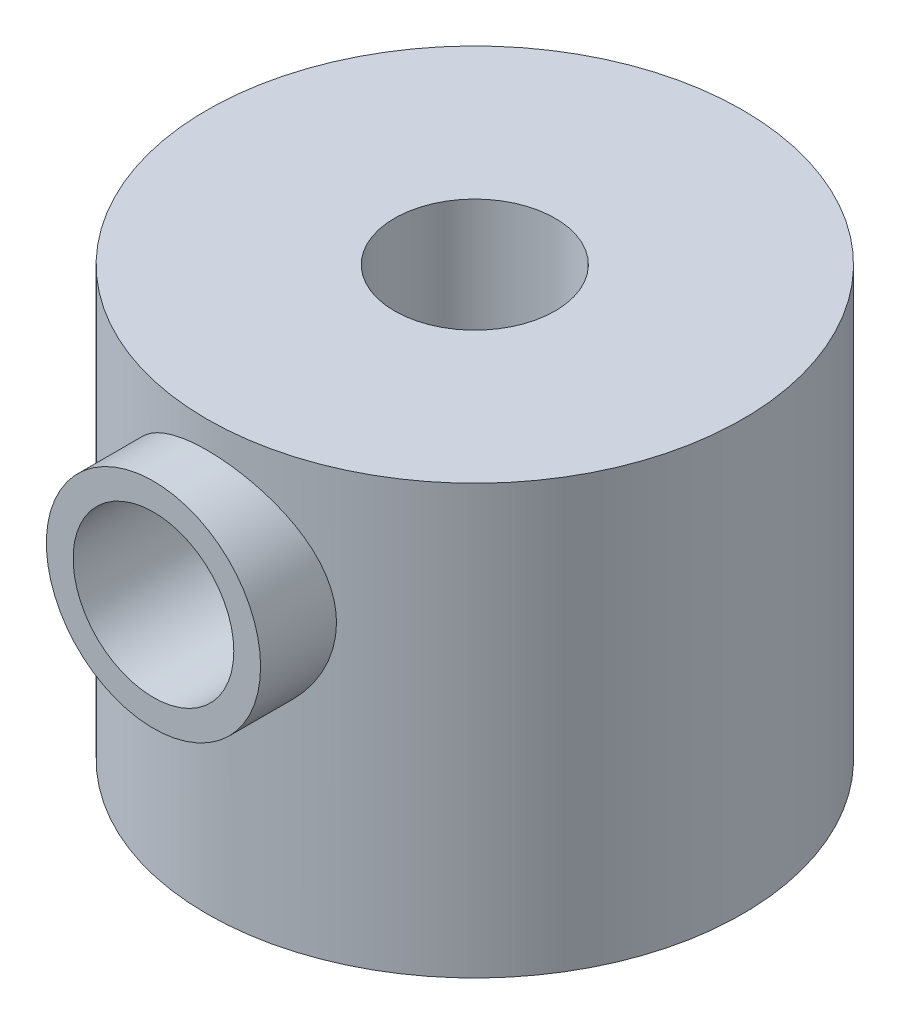
ISO-10303-21;
HEADER;
FILE_DESCRIPTION(('STEP AP214'),'2;1');
FILE_NAME('part.step','',(''),(''),'','','');
FILE_SCHEMA(('AUTOMOTIVE_DESIGN { 1 0 10303 214 1 1 1 1 }'));
ENDSEC;
DATA;
#1=APPLICATION_CONTEXT('core data for automotive mechanical design processes');
#2=APPLICATION_PROTOCOL_DEFINITION('international standard','automotive_design',2000,#1);
#3=PRODUCT_CONTEXT('',#1,'mechanical');
#4=PRODUCT('Part','Part','',(#3));
#5=PRODUCT_RELATED_PRODUCT_CATEGORY('part','',(#4));
#6=PRODUCT_DEFINITION_FORMATION('','',#4);
#7=PRODUCT_DEFINITION_CONTEXT('part definition',#1,'design');
#8=PRODUCT_DEFINITION('design','',#6,#7);
#9=PRODUCT_DEFINITION_SHAPE('','',#8);
#10=(LENGTH_UNIT() NAMED_UNIT(*) SI_UNIT(.MILLI.,.METRE.));
#11=(NAMED_UNIT(*) PLANE_ANGLE_UNIT() SI_UNIT($,.RADIAN.));
#12=(NAMED_UNIT(*) SI_UNIT($,.STERADIAN.) SOLID_ANGLE_UNIT());
#13=UNCERTAINTY_MEASURE_WITH_UNIT(LENGTH_MEASURE(1.E-05),#10,'distance_accuracy_value','');
#14=(GEOMETRIC_REPRESENTATION_CONTEXT(3) GLOBAL_UNCERTAINTY_ASSIGNED_CONTEXT((#13)) GLOBAL_UNIT_ASSIGNED_CONTEXT((#10,
#11,#12)) REPRESENTATION_CONTEXT('',''));
#15=CARTESIAN_POINT('',(0.,0.,0.));
#16=DIRECTION('',(0.,0.,1.));
#17=DIRECTION('',(1.,0.,0.));
#18=AXIS2_PLACEMENT_3D('',#15,#16,#17);
#19=CARTESIAN_POINT('',(0.,8.,0.));
#20=DIRECTION('',(0.,1.,0.));
#21=DIRECTION('',(0.,0.,1.));
#22=AXIS2_PLACEMENT_3D('',#19,#20,#21);
#23=PLANE('',#22);
#24=CARTESIAN_POINT('',(0.,8.,0.));
#25=DIRECTION('',(0.,1.,0.));
#26=DIRECTION('',(0.,0.,1.));
#27=AXIS2_PLACEMENT_3D('',#24,#25,#26);
#28=CIRCLE('',#27,5.);
#29=CARTESIAN_POINT('',(0.,8.,5.));
#30=VERTEX_POINT('',#29);
#31=EDGE_CURVE('E11',#30,#30,#28,.T.);
#32=ORIENTED_EDGE('',*,*,#31,.T.);
#33=EDGE_LOOP('',(#32));
#34=FACE_BOUND('',#33,.T.);
#35=CARTESIAN_POINT('',(0.,8.,0.));
#36=DIRECTION('',(0.,1.,0.));
#37=DIRECTION('',(0.,0.,1.));
#38=AXIS2_PLACEMENT_3D('',#35,#36,#37);
#39=CIRCLE('',#38,1.5);
#40=CARTESIAN_POINT('',(0.,8.,1.5));
#41=VERTEX_POINT('',#40);
#42=EDGE_CURVE('E70',#41,#41,#39,.T.);
#43=ORIENTED_EDGE('',*,*,#42,.F.);
#44=EDGE_LOOP('',(#43));
#45=FACE_BOUND('',#44,.T.);
#46=ADVANCED_FACE('F33',(#34,#45),#23,.T.);
#47=CARTESIAN_POINT('',(0.,0.,0.));
#48=DIRECTION('',(0.,1.,0.));
#49=DIRECTION('',(0.,0.,1.));
#50=AXIS2_PLACEMENT_3D('',#47,#48,#49);
#51=PLANE('',#50);
#52=CARTESIAN_POINT('',(0.,0.,0.));
#53=DIRECTION('',(0.,1.,0.));
#54=DIRECTION('',(0.,0.,1.));
#55=AXIS2_PLACEMENT_3D('',#52,#53,#54);
#56=CIRCLE('',#55,5.);
#57=CARTESIAN_POINT('',(0.,0.,5.));
#58=VERTEX_POINT('',#57);
#59=EDGE_CURVE('E47',#58,#58,#56,.T.);
#60=ORIENTED_EDGE('',*,*,#59,.F.);
#61=EDGE_LOOP('',(#60));
#62=FACE_BOUND('',#61,.T.);
#63=CARTESIAN_POINT('',(0.,0.,0.));
#64=DIRECTION('',(0.,1.,0.));
#65=DIRECTION('',(0.,0.,1.));
#66=AXIS2_PLACEMENT_3D('',#63,#64,#65);
#67=CIRCLE('',#66,1.5);
#68=CARTESIAN_POINT('',(0.,0.,1.5));
#69=VERTEX_POINT('',#68);
#70=EDGE_CURVE('E73',#69,#69,#67,.T.);
#71=ORIENTED_EDGE('',*,*,#70,.T.);
#72=EDGE_LOOP('',(#71));
#73=FACE_BOUND('',#72,.T.);
#74=ADVANCED_FACE('F79',(#62,#73),#51,.F.);
#75=CARTESIAN_POINT('',(0.,8.,0.));
#76=DIRECTION('',(0.,-1.,0.));
#77=DIRECTION('',(0.,0.,-1.));
#78=AXIS2_PLACEMENT_3D('',#75,#76,#77);
#79=CYLINDRICAL_SURFACE('',#78,5.);
#80=CARTESIAN_POINT('',(2.,5.5,4.58257569495584));
#81=CARTESIAN_POINT('',(1.99999540068022,5.39287631028704,4.58258022779737));
#82=CARTESIAN_POINT('',(1.99134173553407,5.28557370566816,4.58638433797122));
#83=CARTESIAN_POINT('',(1.95706710874823,5.07406091590043,4.601110833066));
#84=CARTESIAN_POINT('',(1.93140279032341,4.96985934566148,4.61205140628347));
#85=CARTESIAN_POINT('',(1.86423554476216,4.76794819102917,4.63960410719222));
#86=CARTESIAN_POINT('',(1.82279228998551,4.67021575670878,4.65619484260882));
#87=CARTESIAN_POINT('',(1.72542013194152,4.4831146451377,4.69314677188873));
#88=CARTESIAN_POINT('',(1.66949439157707,4.39374414747589,4.71350714220611));
#89=CARTESIAN_POINT('',(1.54132201423254,4.22073968545567,4.75700861562336));
#90=CARTESIAN_POINT('',(1.46837936836551,4.13764360060276,4.78023917022606));
#91=CARTESIAN_POINT('',(1.30970909513215,3.9844709791442,4.82612457915278));
#92=CARTESIAN_POINT('',(1.22397701877347,3.9143989922903,4.84877922991761));
#93=CARTESIAN_POINT('',(1.03800631337303,3.78659360969029,4.89203407641395));
#94=CARTESIAN_POINT('',(0.937328966419093,3.72945570031406,4.9125180361257));
#95=CARTESIAN_POINT('',(0.726825322068638,3.63315642982621,4.94803927702516));
#96=CARTESIAN_POINT('',(0.617002769076883,3.59398775375113,4.96307877403249));
#97=CARTESIAN_POINT('',(0.396966427039754,3.53665851400691,4.98538324990609));
#98=CARTESIAN_POINT('',(0.287028984858317,3.51757268602978,4.99298936770628));
#99=CARTESIAN_POINT('',(0.0652663285839625,3.49797151421855,5.00080310687431));
#100=CARTESIAN_POINT('',(-0.0465581658394106,3.4974492440342,5.00101348770556));
#101=CARTESIAN_POINT('',(-0.262232494702088,3.5144827698042,4.99421962820612));
#102=CARTESIAN_POINT('',(-0.366177452870456,3.53102477275472,4.98761996771485));
#103=CARTESIAN_POINT('',(-0.569673109221913,3.57999287630297,4.96849291469141));
#104=CARTESIAN_POINT('',(-0.669223484391238,3.61242014239846,4.95596508721342));
#105=CARTESIAN_POINT('',(-0.862897938510558,3.69263648287826,4.92596824457467));
#106=CARTESIAN_POINT('',(-0.956917623378895,3.74064971481538,4.90842760466223));
#107=CARTESIAN_POINT('',(-1.13580815074131,3.85046500691916,4.87014585180275));
#108=CARTESIAN_POINT('',(-1.22067584271796,3.91227179310017,4.84940364267149));
#109=CARTESIAN_POINT('',(-1.38476882799018,4.05264913594388,4.80521637176122));
#110=CARTESIAN_POINT('',(-1.46325784526632,4.1320538925728,4.78168326511759));
#111=CARTESIAN_POINT('',(-1.60610741539265,4.302990571832,4.73561660973263));
#112=CARTESIAN_POINT('',(-1.67046334378698,4.3945264481956,4.71308339008076));
#113=CARTESIAN_POINT('',(-1.78490418871927,4.59041902237394,4.67096897409023));
#114=CARTESIAN_POINT('',(-1.83453465163626,4.69506483033865,4.65148914057708));
#115=CARTESIAN_POINT('',(-1.91517625986646,4.91221549031222,4.61887590344084));
#116=CARTESIAN_POINT('',(-1.94619949837798,5.02471518472659,4.60573837891311));
#117=CARTESIAN_POINT('',(-1.9869549488549,5.24703577746743,4.58829759702716));
#118=CARTESIAN_POINT('',(-1.99787209681454,5.35660044712856,4.58350366456138));
#119=CARTESIAN_POINT('',(-2.00156132644289,5.57607720775956,4.58189497869038));
#120=CARTESIAN_POINT('',(-1.99433891059128,5.68598918327565,4.58507780560362));
#121=CARTESIAN_POINT('',(-1.96303289479003,5.89645893495694,4.59856044359113));
#122=CARTESIAN_POINT('',(-1.93993306202386,5.99719293740006,4.60844457798301));
#123=CARTESIAN_POINT('',(-1.87880418691087,6.19328840478545,4.6337005102734));
#124=CARTESIAN_POINT('',(-1.84077183430228,6.28864867310715,4.64907352488598));
#125=CARTESIAN_POINT('',(-1.74913563948157,6.47560235779566,4.68433781860101));
#126=CARTESIAN_POINT('',(-1.69496286826465,6.56688618869453,4.70438704639177));
#127=CARTESIAN_POINT('',(-1.57316522444182,6.73948298744159,4.74650385157795));
#128=CARTESIAN_POINT('',(-1.50553487348189,6.82079187279545,4.76857224896045));
#129=CARTESIAN_POINT('',(-1.35284421168058,6.97737340859937,4.81420915971416));
#130=CARTESIAN_POINT('',(-1.26686542944543,7.0517565652916,4.83776807285233));
#131=CARTESIAN_POINT('',(-1.0830836333685,7.18517707660977,4.88219794567532));
#132=CARTESIAN_POINT('',(-0.985280138466608,7.24421380659512,4.90306879593136));
#133=CARTESIAN_POINT('',(-0.780279934003014,7.34504762646334,4.9398371590039));
#134=CARTESIAN_POINT('',(-0.673085480998744,7.38684884417366,4.9557358624066));
#135=CARTESIAN_POINT('',(-0.452393590914547,7.45154885239976,4.98072713468904));
#136=CARTESIAN_POINT('',(-0.338899610276819,7.47445790141069,4.98982339706103));
#137=CARTESIAN_POINT('',(-0.116816510362614,7.49950470165285,4.99979008211858));
#138=CARTESIAN_POINT('',(-0.00839049265208607,7.50290012856203,5.00115846749745));
#139=CARTESIAN_POINT('',(0.207433835792266,7.49214452061653,4.99686042373721));
#140=CARTESIAN_POINT('',(0.314832299614388,7.47799614184442,4.99119505948774));
#141=CARTESIAN_POINT('',(0.522170901733398,7.43345321200012,4.97371513381836));
#142=CARTESIAN_POINT('',(0.622238803864868,7.40357105524345,4.96209480698998));
#143=CARTESIAN_POINT('',(0.815922355542603,7.32894719411893,4.93394947767358));
#144=CARTESIAN_POINT('',(0.909536811189122,7.28420274906091,4.91742357062859));
#145=CARTESIAN_POINT('',(1.09220303880515,7.17889680664677,4.88018094611867));
#146=CARTESIAN_POINT('',(1.18087037518738,7.11772372467486,4.859311306872));
#147=CARTESIAN_POINT('',(1.34705404014793,6.982211461253,4.8158940222708));
#148=CARTESIAN_POINT('',(1.42456572919735,6.90786683039178,4.79334568464253));
#149=CARTESIAN_POINT('',(1.57120121894449,6.74268485315134,4.7473776736768));
#150=CARTESIAN_POINT('',(1.63950871002775,6.6511114248559,4.72399047228096));
#151=CARTESIAN_POINT('',(1.75984762763149,6.45705756427917,4.68049656850749));
#152=CARTESIAN_POINT('',(1.81187714055767,6.35457585154645,4.66039025195448));
#153=CARTESIAN_POINT('',(1.89399048451634,6.1509638135298,4.62758914239064));
#154=CARTESIAN_POINT('',(1.92562535665267,6.05053839728756,4.61439096680415));
#155=CARTESIAN_POINT('',(1.97271990928489,5.84551095850736,4.5944582603412));
#156=CARTESIAN_POINT('',(1.98822466191608,5.74092142657564,4.58770572290435));
#157=CARTESIAN_POINT('',(1.99692202185513,5.61322176088848,4.5839176394209));
#158=CARTESIAN_POINT('',(1.99807530751895,5.59059851964357,4.58341531117284));
#159=CARTESIAN_POINT('',(1.9996148112425,5.54531952320278,4.58274384722723));
#160=CARTESIAN_POINT('',(2.0000009730612,5.52266376574484,4.5825747359592));
#161=CARTESIAN_POINT('',(2.,5.5,4.58257569495584));
#162=B_SPLINE_CURVE_WITH_KNOTS('',3,(#80,#81,#82,#83,#84,#85,#86,#87,#88,#89,#90,#91,#92,#93,
#94,#95,#96,#97,#98,#99,#100,#101,#102,#103,#104,#105,#106,#107,#108,#109,#110,#111,#112,#113,
#114,#115,#116,#117,#118,#119,#120,#121,#122,#123,#124,#125,#126,#127,#128,#129,#130,#131,#132,
#133,#134,#135,#136,#137,#138,#139,#140,#141,#142,#143,#144,#145,#146,#147,#148,#149,#150,#151,
#152,#153,#154,#155,#156,#157,#158,#159,#160,#161),.UNSPECIFIED.,.T.,.F.,(4,2,2,2,2,2,2,2,2,2,2,
2,2,2,2,2,2,2,2,2,2,2,2,2,2,2,2,2,2,2,2,2,2,2,2,2,2,2,2,2,4),(0.,0.321277648767654,
0.643377335822245,0.96427082329339,1.28509428823861,1.62255618284425,1.96013574348342,
2.31102669091428,2.6617746696948,2.99554182887183,3.32918445305672,3.64408644830302,
3.95901155129059,4.27868300234898,4.59846414940031,4.93924044081356,5.28012807127127,
5.63064458717257,5.98093304800101,6.3098214752442,6.63861014907939,6.94867248085145,
7.25880358651638,7.58151154652701,7.90435114525849,8.25103734246979,8.59773764852748,
8.94435487312812,9.29078375954136,9.61461039755953,9.93838801512602,10.2522199444335,
10.5661097782859,10.8938705113993,11.2217671656421,11.5699625328561,11.9181988175919,
12.2351666081908,12.5512463021924,12.619212852096,12.6871843847255),.UNSPECIFIED.);
#163=CARTESIAN_POINT('',(2.,5.5,4.58257569495584));
#164=VERTEX_POINT('',#163);
#165=EDGE_CURVE('E38',#164,#164,#162,.T.);
#166=ORIENTED_EDGE('',*,*,#165,.T.);
#167=EDGE_LOOP('',(#166));
#168=FACE_BOUND('',#167,.T.);
#169=ORIENTED_EDGE('',*,*,#31,.F.);
#170=EDGE_LOOP('',(#169));
#171=FACE_BOUND('',#170,.T.);
#172=ORIENTED_EDGE('',*,*,#59,.T.);
#173=EDGE_LOOP('',(#172));
#174=FACE_BOUND('',#173,.T.);
#175=ADVANCED_FACE('F35',(#168,#171,#174),#79,.T.);
#176=CARTESIAN_POINT('',(0.,8.,0.));
#177=DIRECTION('',(0.,-1.,0.));
#178=DIRECTION('',(0.,0.,-1.));
#179=AXIS2_PLACEMENT_3D('',#176,#177,#178);
#180=CYLINDRICAL_SURFACE('',#179,1.5);
#181=CARTESIAN_POINT('',(0.,5.5,0.));
#182=DIRECTION('',(0.,-0.707106781186547,0.707106781186547));
#183=DIRECTION('',(0.,-0.707106781186547,-0.707106781186547));
#184=AXIS2_PLACEMENT_3D('',#181,#182,#183);
#185=ELLIPSE('',#184,2.12132034355964,1.5);
#186=CARTESIAN_POINT('',(-1.5,5.5,0.));
#187=VERTEX_POINT('',#186);
#188=CARTESIAN_POINT('',(1.5,5.5,0.));
#189=VERTEX_POINT('',#188);
#190=EDGE_CURVE('E54',#187,#189,#185,.F.);
#191=ORIENTED_EDGE('',*,*,#190,.F.);
#192=CARTESIAN_POINT('',(0.,5.5,0.));
#193=DIRECTION('',(0.,-0.707106781186547,-0.707106781186547));
#194=DIRECTION('',(0.,-0.707106781186547,0.707106781186547));
#195=AXIS2_PLACEMENT_3D('',#192,#193,#194);
#196=ELLIPSE('',#195,2.12132034355964,1.5);
#197=EDGE_CURVE('E56',#189,#187,#196,.T.);
#198=ORIENTED_EDGE('',*,*,#197,.F.);
#199=EDGE_LOOP('',(#191,#198));
#200=FACE_BOUND('',#199,.T.);
#201=ORIENTED_EDGE('',*,*,#42,.T.);
#202=EDGE_LOOP('',(#201));
#203=FACE_BOUND('',#202,.T.);
#204=ORIENTED_EDGE('',*,*,#70,.F.);
#205=EDGE_LOOP('',(#204));
#206=FACE_BOUND('',#205,.T.);
#207=ADVANCED_FACE('F62',(#200,#203,#206),#180,.F.);
#208=CARTESIAN_POINT('',(0.,5.5,2.5));
#209=DIRECTION('',(0.,0.,1.));
#210=DIRECTION('',(1.,0.,0.));
#211=AXIS2_PLACEMENT_3D('',#208,#209,#210);
#212=CYLINDRICAL_SURFACE('',#211,2.);
#213=CARTESIAN_POINT('',(0.,5.5,6.));
#214=DIRECTION('',(0.,0.,1.));
#215=DIRECTION('',(1.,0.,0.));
#216=AXIS2_PLACEMENT_3D('',#213,#214,#215);
#217=CIRCLE('',#216,2.);
#218=CARTESIAN_POINT('',(2.,5.5,6.));
#219=VERTEX_POINT('',#218);
#220=EDGE_CURVE('E64',#219,#219,#217,.T.);
#221=ORIENTED_EDGE('',*,*,#220,.F.);
#222=EDGE_LOOP('',(#221));
#223=FACE_BOUND('',#222,.T.);
#224=ORIENTED_EDGE('',*,*,#165,.F.);
#225=EDGE_LOOP('',(#224));
#226=FACE_BOUND('',#225,.T.);
#227=ADVANCED_FACE('F85',(#223,#226),#212,.T.);
#228=CARTESIAN_POINT('',(0.,5.5,6.));
#229=DIRECTION('',(0.,0.,1.));
#230=DIRECTION('',(1.,0.,0.));
#231=AXIS2_PLACEMENT_3D('',#228,#229,#230);
#232=PLANE('',#231);
#233=CARTESIAN_POINT('',(0.,5.5,6.));
#234=DIRECTION('',(0.,0.,1.));
#235=DIRECTION('',(1.,0.,0.));
#236=AXIS2_PLACEMENT_3D('',#233,#234,#235);
#237=CIRCLE('',#236,1.5);
#238=CARTESIAN_POINT('',(1.5,5.5,6.));
#239=VERTEX_POINT('',#238);
#240=EDGE_CURVE('E60',#239,#239,#237,.T.);
#241=ORIENTED_EDGE('',*,*,#240,.F.);
#242=EDGE_LOOP('',(#241));
#243=FACE_BOUND('',#242,.T.);
#244=ORIENTED_EDGE('',*,*,#220,.T.);
#245=EDGE_LOOP('',(#244));
#246=FACE_BOUND('',#245,.T.);
#247=ADVANCED_FACE('F91',(#243,#246),#232,.T.);
#248=CARTESIAN_POINT('',(0.,5.5,-4.24264068711929));
#249=DIRECTION('',(0.,0.,1.));
#250=DIRECTION('',(1.,0.,0.));
#251=AXIS2_PLACEMENT_3D('',#248,#249,#250);
#252=CYLINDRICAL_SURFACE('',#251,1.5);
#253=ORIENTED_EDGE('',*,*,#190,.T.);
#254=ORIENTED_EDGE('',*,*,#197,.T.);
#255=EDGE_LOOP('',(#253,#254));
#256=FACE_BOUND('',#255,.T.);
#257=ORIENTED_EDGE('',*,*,#240,.T.);
#258=EDGE_LOOP('',(#257));
#259=FACE_BOUND('',#258,.T.);
#260=ADVANCED_FACE('F57',(#256,#259),#252,.F.);
#261=CLOSED_SHELL('',(#46,#74,#175,#207,#227,#247,#260));
#262=MANIFOLD_SOLID_BREP('B2',#261);
#263=ADVANCED_BREP_SHAPE_REPRESENTATION('',(#18,#262),#14);
#264=SHAPE_DEFINITION_REPRESENTATION(#9,#263);
ENDSEC;
END-ISO-10303-21;
